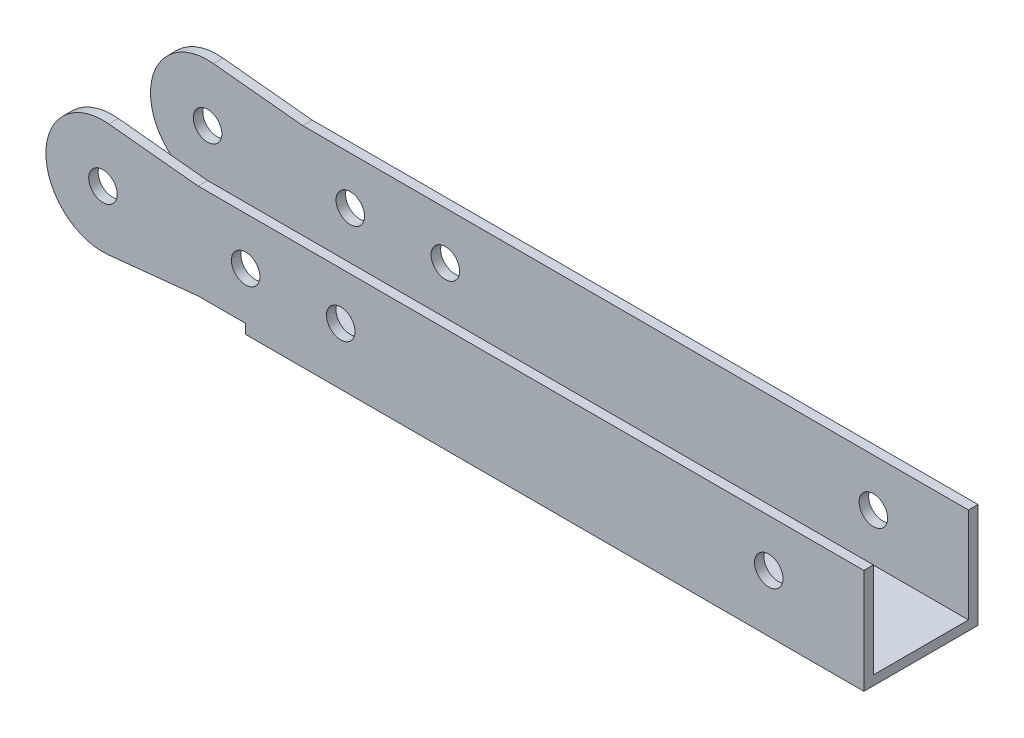
ISO-10303-21;
HEADER;
FILE_DESCRIPTION(('STEP AP214'),'2;1');
FILE_NAME('part.step','',(''),(''),'','','');
FILE_SCHEMA(('AUTOMOTIVE_DESIGN { 1 0 10303 214 1 1 1 1 }'));
ENDSEC;
DATA;
#1=APPLICATION_CONTEXT('core data for automotive mechanical design processes');
#2=APPLICATION_PROTOCOL_DEFINITION('international standard','automotive_design',2000,#1);
#3=PRODUCT_CONTEXT('',#1,'mechanical');
#4=PRODUCT('Part','Part','',(#3));
#5=PRODUCT_RELATED_PRODUCT_CATEGORY('part','',(#4));
#6=PRODUCT_DEFINITION_FORMATION('','',#4);
#7=PRODUCT_DEFINITION_CONTEXT('part definition',#1,'design');
#8=PRODUCT_DEFINITION('design','',#6,#7);
#9=PRODUCT_DEFINITION_SHAPE('','',#8);
#10=(LENGTH_UNIT() NAMED_UNIT(*) SI_UNIT(.MILLI.,.METRE.));
#11=(NAMED_UNIT(*) PLANE_ANGLE_UNIT() SI_UNIT($,.RADIAN.));
#12=(NAMED_UNIT(*) SI_UNIT($,.STERADIAN.) SOLID_ANGLE_UNIT());
#13=UNCERTAINTY_MEASURE_WITH_UNIT(LENGTH_MEASURE(1.E-05),#10,'distance_accuracy_value','');
#14=(GEOMETRIC_REPRESENTATION_CONTEXT(3) GLOBAL_UNCERTAINTY_ASSIGNED_CONTEXT((#13)) GLOBAL_UNIT_ASSIGNED_CONTEXT((#10,
#11,#12)) REPRESENTATION_CONTEXT('',''));
#15=CARTESIAN_POINT('',(0.,0.,0.));
#16=DIRECTION('',(0.,0.,1.));
#17=DIRECTION('',(1.,0.,0.));
#18=AXIS2_PLACEMENT_3D('',#15,#16,#17);
#19=CARTESIAN_POINT('',(-26.8000000000001,-2.,11.));
#20=DIRECTION('',(0.,1.,0.));
#21=DIRECTION('',(0.,0.,1.));
#22=AXIS2_PLACEMENT_3D('',#19,#20,#21);
#23=PLANE('',#22);
#24=DIRECTION('',(0.,0.,-1.));
#25=VECTOR('',#24,1.);
#26=CARTESIAN_POINT('',(-21.8000000000001,-2.,-1.00000000000001));
#27=LINE('',#26,#25);
#28=CARTESIAN_POINT('',(-21.8000000000001,-2.,11.));
#29=VERTEX_POINT('',#28);
#30=CARTESIAN_POINT('',(-21.8000000000001,-2.,10.));
#31=VERTEX_POINT('',#30);
#32=EDGE_CURVE('E151',#29,#31,#27,.T.);
#33=ORIENTED_EDGE('',*,*,#32,.F.);
#34=DIRECTION('',(1.,0.,0.));
#35=VECTOR('',#34,1.);
#36=CARTESIAN_POINT('',(-26.8000000000001,-2.,11.));
#37=LINE('',#36,#35);
#38=CARTESIAN_POINT('',(-26.8000000000001,-2.,11.));
#39=VERTEX_POINT('',#38);
#40=EDGE_CURVE('E119',#39,#29,#37,.T.);
#41=ORIENTED_EDGE('',*,*,#40,.F.);
#42=DIRECTION('',(0.,0.,-1.));
#43=VECTOR('',#42,1.);
#44=CARTESIAN_POINT('',(-26.8000000000001,-2.,11.));
#45=LINE('',#44,#43);
#46=CARTESIAN_POINT('',(-26.8000000000001,-2.,10.));
#47=VERTEX_POINT('',#46);
#48=EDGE_CURVE('E114',#39,#47,#45,.T.);
#49=ORIENTED_EDGE('',*,*,#48,.T.);
#50=DIRECTION('',(1.,0.,0.));
#51=VECTOR('',#50,1.);
#52=CARTESIAN_POINT('',(-26.8000000000001,-2.,10.));
#53=LINE('',#52,#51);
#54=EDGE_CURVE('E135',#47,#31,#53,.T.);
#55=ORIENTED_EDGE('',*,*,#54,.T.);
#56=EDGE_LOOP('',(#33,#41,#49,#55));
#57=FACE_BOUND('',#56,.T.);
#58=ADVANCED_FACE('F36',(#57),#23,.F.);
#59=CARTESIAN_POINT('',(-36.8000000000001,3.,11.));
#60=DIRECTION('',(0.,0.,1.));
#61=DIRECTION('',(1.,0.,0.));
#62=AXIS2_PLACEMENT_3D('',#59,#60,#61);
#63=PLANE('',#62);
#64=CARTESIAN_POINT('',(-21.8000000000001,3.,11.));
#65=DIRECTION('',(0.,0.,1.));
#66=DIRECTION('',(1.,0.,0.));
#67=AXIS2_PLACEMENT_3D('',#64,#65,#66);
#68=CIRCLE('',#67,1.5);
#69=CARTESIAN_POINT('',(-20.3000000000001,3.,11.));
#70=VERTEX_POINT('',#69);
#71=EDGE_CURVE('E299',#70,#70,#68,.T.);
#72=ORIENTED_EDGE('',*,*,#71,.F.);
#73=EDGE_LOOP('',(#72));
#74=FACE_BOUND('',#73,.T.);
#75=CARTESIAN_POINT('',(33.1999999999999,3.,11.));
#76=DIRECTION('',(0.,0.,1.));
#77=DIRECTION('',(1.,0.,0.));
#78=AXIS2_PLACEMENT_3D('',#75,#76,#77);
#79=CIRCLE('',#78,1.5);
#80=CARTESIAN_POINT('',(34.6999999999999,3.,11.));
#81=VERTEX_POINT('',#80);
#82=EDGE_CURVE('E130',#81,#81,#79,.T.);
#83=ORIENTED_EDGE('',*,*,#82,.F.);
#84=EDGE_LOOP('',(#83));
#85=FACE_BOUND('',#84,.T.);
#86=DIRECTION('',(-1.,0.,0.));
#87=VECTOR('',#86,1.);
#88=CARTESIAN_POINT('',(43.1999999999999,8.01039303833166,11.));
#89=LINE('',#88,#87);
#90=CARTESIAN_POINT('',(43.1999999999999,8.01039303833166,11.));
#91=VERTEX_POINT('',#90);
#92=CARTESIAN_POINT('',(-26.8000000000001,8.01039303833165,11.));
#93=VERTEX_POINT('',#92);
#94=EDGE_CURVE('E139',#91,#93,#89,.T.);
#95=ORIENTED_EDGE('',*,*,#94,.T.);
#96=DIRECTION('',(-0.994830345045225,0.101550896486432,0.));
#97=VECTOR('',#96,1.);
#98=CARTESIAN_POINT('',(-26.8000000000001,8.01039303833165,11.));
#99=LINE('',#98,#97);
#100=CARTESIAN_POINT('',(-36.1906946210815,8.96898207027135,11.));
#101=VERTEX_POINT('',#100);
#102=EDGE_CURVE('E90',#93,#101,#99,.T.);
#103=ORIENTED_EDGE('',*,*,#102,.T.);
#104=CARTESIAN_POINT('',(-36.8000000000001,3.,11.));
#105=DIRECTION('',(0.,0.,1.));
#106=DIRECTION('',(1.,0.,0.));
#107=AXIS2_PLACEMENT_3D('',#104,#105,#106);
#108=CIRCLE('',#107,6.);
#109=CARTESIAN_POINT('',(-36.1841554716937,-2.96831094338717,11.));
#110=VERTEX_POINT('',#109);
#111=EDGE_CURVE('E96',#101,#110,#108,.T.);
#112=ORIENTED_EDGE('',*,*,#111,.T.);
#113=DIRECTION('',(0.994718490564528,0.102640754717736,0.));
#114=VECTOR('',#113,1.);
#115=CARTESIAN_POINT('',(-36.1841554716937,-2.96831094338717,11.));
#116=LINE('',#115,#114);
#117=EDGE_CURVE('E102',#110,#39,#116,.T.);
#118=ORIENTED_EDGE('',*,*,#117,.T.);
#119=ORIENTED_EDGE('',*,*,#40,.T.);
#120=DIRECTION('',(0.,1.,0.));
#121=VECTOR('',#120,1.);
#122=CARTESIAN_POINT('',(-21.8000000000001,-3.,11.));
#123=LINE('',#122,#121);
#124=CARTESIAN_POINT('',(-21.8000000000001,-3.,11.));
#125=VERTEX_POINT('',#124);
#126=EDGE_CURVE('E155',#125,#29,#123,.T.);
#127=ORIENTED_EDGE('',*,*,#126,.F.);
#128=DIRECTION('',(-1.,0.,0.));
#129=VECTOR('',#128,1.);
#130=CARTESIAN_POINT('',(-21.8000000000001,-3.,11.));
#131=LINE('',#130,#129);
#132=CARTESIAN_POINT('',(43.1999999999999,-3.,11.));
#133=VERTEX_POINT('',#132);
#134=EDGE_CURVE('E273',#133,#125,#131,.T.);
#135=ORIENTED_EDGE('',*,*,#134,.F.);
#136=DIRECTION('',(0.,1.,0.));
#137=VECTOR('',#136,1.);
#138=CARTESIAN_POINT('',(43.1999999999999,-2.,11.));
#139=LINE('',#138,#137);
#140=EDGE_CURVE('E53',#133,#91,#139,.T.);
#141=ORIENTED_EDGE('',*,*,#140,.T.);
#142=EDGE_LOOP('',(#95,#103,#112,#118,#119,#127,#135,#141));
#143=FACE_BOUND('',#142,.T.);
#144=CARTESIAN_POINT('',(-11.8000000000001,3.,11.));
#145=DIRECTION('',(0.,0.,1.));
#146=DIRECTION('',(1.,0.,0.));
#147=AXIS2_PLACEMENT_3D('',#144,#145,#146);
#148=CIRCLE('',#147,1.5);
#149=CARTESIAN_POINT('',(-10.3000000000001,3.,11.));
#150=VERTEX_POINT('',#149);
#151=EDGE_CURVE('E305',#150,#150,#148,.T.);
#152=ORIENTED_EDGE('',*,*,#151,.F.);
#153=EDGE_LOOP('',(#152));
#154=FACE_BOUND('',#153,.T.);
#155=CARTESIAN_POINT('',(-36.8000000000001,3.,11.));
#156=DIRECTION('',(0.,0.,1.));
#157=DIRECTION('',(1.,0.,0.));
#158=AXIS2_PLACEMENT_3D('',#155,#156,#157);
#159=CIRCLE('',#158,1.5);
#160=CARTESIAN_POINT('',(-35.3000000000001,3.,11.));
#161=VERTEX_POINT('',#160);
#162=EDGE_CURVE('E293',#161,#161,#159,.T.);
#163=ORIENTED_EDGE('',*,*,#162,.F.);
#164=EDGE_LOOP('',(#163));
#165=FACE_BOUND('',#164,.T.);
#166=ADVANCED_FACE('F98',(#74,#85,#143,#154,#165),#63,.T.);
#167=CARTESIAN_POINT('',(-36.8000000000001,3.,10.));
#168=DIRECTION('',(0.,0.,1.));
#169=DIRECTION('',(1.,0.,0.));
#170=AXIS2_PLACEMENT_3D('',#167,#168,#169);
#171=PLANE('',#170);
#172=DIRECTION('',(-1.,0.,0.));
#173=VECTOR('',#172,1.);
#174=CARTESIAN_POINT('',(43.1999999999999,8.01039303833166,10.));
#175=LINE('',#174,#173);
#176=CARTESIAN_POINT('',(43.1999999999999,8.01039303833166,10.));
#177=VERTEX_POINT('',#176);
#178=CARTESIAN_POINT('',(-26.8000000000001,8.01039303833165,10.));
#179=VERTEX_POINT('',#178);
#180=EDGE_CURVE('E126',#177,#179,#175,.T.);
#181=ORIENTED_EDGE('',*,*,#180,.F.);
#182=DIRECTION('',(0.,1.,0.));
#183=VECTOR('',#182,1.);
#184=CARTESIAN_POINT('',(43.1999999999999,-2.,10.));
#185=LINE('',#184,#183);
#186=CARTESIAN_POINT('',(43.1999999999999,-2.,10.));
#187=VERTEX_POINT('',#186);
#188=EDGE_CURVE('E82',#187,#177,#185,.T.);
#189=ORIENTED_EDGE('',*,*,#188,.F.);
#190=DIRECTION('',(-1.,0.,0.));
#191=VECTOR('',#190,1.);
#192=CARTESIAN_POINT('',(-36.8000000000001,-2.,10.));
#193=LINE('',#192,#191);
#194=EDGE_CURVE('E290',#187,#31,#193,.T.);
#195=ORIENTED_EDGE('',*,*,#194,.T.);
#196=ORIENTED_EDGE('',*,*,#54,.F.);
#197=DIRECTION('',(0.994718490564528,0.102640754717736,0.));
#198=VECTOR('',#197,1.);
#199=CARTESIAN_POINT('',(-36.1841554716937,-2.96831094338717,10.));
#200=LINE('',#199,#198);
#201=CARTESIAN_POINT('',(-36.1841554716937,-2.96831094338717,10.));
#202=VERTEX_POINT('',#201);
#203=EDGE_CURVE('E133',#202,#47,#200,.T.);
#204=ORIENTED_EDGE('',*,*,#203,.F.);
#205=CARTESIAN_POINT('',(-36.8000000000001,3.,10.));
#206=DIRECTION('',(0.,0.,1.));
#207=DIRECTION('',(1.,0.,0.));
#208=AXIS2_PLACEMENT_3D('',#205,#206,#207);
#209=CIRCLE('',#208,6.);
#210=CARTESIAN_POINT('',(-36.1906946210815,8.96898207027135,10.));
#211=VERTEX_POINT('',#210);
#212=EDGE_CURVE('E111',#211,#202,#209,.T.);
#213=ORIENTED_EDGE('',*,*,#212,.F.);
#214=DIRECTION('',(-0.994830345045225,0.101550896486432,0.));
#215=VECTOR('',#214,1.);
#216=CARTESIAN_POINT('',(-26.8000000000001,8.01039303833165,10.));
#217=LINE('',#216,#215);
#218=EDGE_CURVE('E129',#179,#211,#217,.T.);
#219=ORIENTED_EDGE('',*,*,#218,.F.);
#220=EDGE_LOOP('',(#181,#189,#195,#196,#204,#213,#219));
#221=FACE_BOUND('',#220,.T.);
#222=CARTESIAN_POINT('',(33.1999999999999,3.,10.));
#223=DIRECTION('',(0.,0.,1.));
#224=DIRECTION('',(1.,0.,0.));
#225=AXIS2_PLACEMENT_3D('',#222,#223,#224);
#226=CIRCLE('',#225,1.5);
#227=CARTESIAN_POINT('',(34.6999999999999,3.,10.));
#228=VERTEX_POINT('',#227);
#229=EDGE_CURVE('E308',#228,#228,#226,.T.);
#230=ORIENTED_EDGE('',*,*,#229,.T.);
#231=EDGE_LOOP('',(#230));
#232=FACE_BOUND('',#231,.T.);
#233=CARTESIAN_POINT('',(-11.8000000000001,3.,10.));
#234=DIRECTION('',(0.,0.,1.));
#235=DIRECTION('',(1.,0.,0.));
#236=AXIS2_PLACEMENT_3D('',#233,#234,#235);
#237=CIRCLE('',#236,1.5);
#238=CARTESIAN_POINT('',(-10.3000000000001,3.,10.));
#239=VERTEX_POINT('',#238);
#240=EDGE_CURVE('E302',#239,#239,#237,.T.);
#241=ORIENTED_EDGE('',*,*,#240,.T.);
#242=EDGE_LOOP('',(#241));
#243=FACE_BOUND('',#242,.T.);
#244=CARTESIAN_POINT('',(-21.8000000000001,3.,10.));
#245=DIRECTION('',(0.,0.,1.));
#246=DIRECTION('',(1.,0.,0.));
#247=AXIS2_PLACEMENT_3D('',#244,#245,#246);
#248=CIRCLE('',#247,1.5);
#249=CARTESIAN_POINT('',(-20.3000000000001,3.,10.));
#250=VERTEX_POINT('',#249);
#251=EDGE_CURVE('E296',#250,#250,#248,.T.);
#252=ORIENTED_EDGE('',*,*,#251,.T.);
#253=EDGE_LOOP('',(#252));
#254=FACE_BOUND('',#253,.T.);
#255=CARTESIAN_POINT('',(-36.8000000000001,3.,10.));
#256=DIRECTION('',(0.,0.,1.));
#257=DIRECTION('',(1.,0.,0.));
#258=AXIS2_PLACEMENT_3D('',#255,#256,#257);
#259=CIRCLE('',#258,1.5);
#260=CARTESIAN_POINT('',(-35.3000000000001,3.,10.));
#261=VERTEX_POINT('',#260);
#262=EDGE_CURVE('E292',#261,#261,#259,.T.);
#263=ORIENTED_EDGE('',*,*,#262,.T.);
#264=EDGE_LOOP('',(#263));
#265=FACE_BOUND('',#264,.T.);
#266=ADVANCED_FACE('F143',(#221,#232,#243,#254,#265),#171,.F.);
#267=CARTESIAN_POINT('',(43.1999999999999,8.01039303833166,11.));
#268=DIRECTION('',(0.,-1.,0.));
#269=DIRECTION('',(1.,0.,0.));
#270=AXIS2_PLACEMENT_3D('',#267,#268,#269);
#271=PLANE('',#270);
#272=ORIENTED_EDGE('',*,*,#180,.T.);
#273=DIRECTION('',(0.,0.,-1.));
#274=VECTOR('',#273,1.);
#275=CARTESIAN_POINT('',(-26.8000000000001,8.01039303833165,11.));
#276=LINE('',#275,#274);
#277=EDGE_CURVE('E11',#93,#179,#276,.T.);
#278=ORIENTED_EDGE('',*,*,#277,.F.);
#279=ORIENTED_EDGE('',*,*,#94,.F.);
#280=DIRECTION('',(0.,0.,-1.));
#281=VECTOR('',#280,1.);
#282=CARTESIAN_POINT('',(43.1999999999999,8.01039303833166,11.));
#283=LINE('',#282,#281);
#284=EDGE_CURVE('E125',#91,#177,#283,.T.);
#285=ORIENTED_EDGE('',*,*,#284,.T.);
#286=EDGE_LOOP('',(#272,#278,#279,#285));
#287=FACE_BOUND('',#286,.T.);
#288=ADVANCED_FACE('F38',(#287),#271,.F.);
#289=CARTESIAN_POINT('',(-26.8000000000001,8.01039303833165,11.));
#290=DIRECTION('',(-0.101550896486432,-0.994830345045225,0.));
#291=DIRECTION('',(0.994830345045225,-0.101550896486432,0.));
#292=AXIS2_PLACEMENT_3D('',#289,#290,#291);
#293=PLANE('',#292);
#294=ORIENTED_EDGE('',*,*,#218,.T.);
#295=DIRECTION('',(0.,0.,-1.));
#296=VECTOR('',#295,1.);
#297=CARTESIAN_POINT('',(-36.1906946210815,8.96898207027135,11.));
#298=LINE('',#297,#296);
#299=EDGE_CURVE('E45',#101,#211,#298,.T.);
#300=ORIENTED_EDGE('',*,*,#299,.F.);
#301=ORIENTED_EDGE('',*,*,#102,.F.);
#302=ORIENTED_EDGE('',*,*,#277,.T.);
#303=EDGE_LOOP('',(#294,#300,#301,#302));
#304=FACE_BOUND('',#303,.T.);
#305=ADVANCED_FACE('F318',(#304),#293,.F.);
#306=CARTESIAN_POINT('',(-36.8000000000001,3.,11.));
#307=DIRECTION('',(0.,0.,-1.));
#308=DIRECTION('',(-1.,0.,0.));
#309=AXIS2_PLACEMENT_3D('',#306,#307,#308);
#310=CYLINDRICAL_SURFACE('',#309,6.);
#311=ORIENTED_EDGE('',*,*,#212,.T.);
#312=DIRECTION('',(0.,0.,-1.));
#313=VECTOR('',#312,1.);
#314=CARTESIAN_POINT('',(-36.1841554716937,-2.96831094338717,11.));
#315=LINE('',#314,#313);
#316=EDGE_CURVE('E108',#110,#202,#315,.T.);
#317=ORIENTED_EDGE('',*,*,#316,.F.);
#318=ORIENTED_EDGE('',*,*,#111,.F.);
#319=ORIENTED_EDGE('',*,*,#299,.T.);
#320=EDGE_LOOP('',(#311,#317,#318,#319));
#321=FACE_BOUND('',#320,.T.);
#322=ADVANCED_FACE('F109',(#321),#310,.T.);
#323=CARTESIAN_POINT('',(-36.1841554716937,-2.96831094338717,11.));
#324=DIRECTION('',(-0.102640754717736,0.994718490564528,0.));
#325=DIRECTION('',(-0.994718490564528,-0.102640754717736,0.));
#326=AXIS2_PLACEMENT_3D('',#323,#324,#325);
#327=PLANE('',#326);
#328=ORIENTED_EDGE('',*,*,#203,.T.);
#329=ORIENTED_EDGE('',*,*,#48,.F.);
#330=ORIENTED_EDGE('',*,*,#117,.F.);
#331=ORIENTED_EDGE('',*,*,#316,.T.);
#332=EDGE_LOOP('',(#328,#329,#330,#331));
#333=FACE_BOUND('',#332,.T.);
#334=ADVANCED_FACE('F116',(#333),#327,.F.);
#335=CARTESIAN_POINT('',(43.1999999999999,-2.,11.));
#336=DIRECTION('',(-1.,0.,0.));
#337=DIRECTION('',(0.,0.,1.));
#338=AXIS2_PLACEMENT_3D('',#335,#336,#337);
#339=PLANE('',#338);
#340=ORIENTED_EDGE('',*,*,#188,.T.);
#341=ORIENTED_EDGE('',*,*,#284,.F.);
#342=ORIENTED_EDGE('',*,*,#140,.F.);
#343=DIRECTION('',(0.,0.,1.));
#344=VECTOR('',#343,1.);
#345=CARTESIAN_POINT('',(43.1999999999999,-3.,11.));
#346=LINE('',#345,#344);
#347=CARTESIAN_POINT('',(43.1999999999999,-3.,-1.));
#348=VERTEX_POINT('',#347);
#349=EDGE_CURVE('E280',#348,#133,#346,.T.);
#350=ORIENTED_EDGE('',*,*,#349,.F.);
#351=DIRECTION('',(0.,1.,0.));
#352=VECTOR('',#351,1.);
#353=CARTESIAN_POINT('',(43.1999999999999,-3.,-1.));
#354=LINE('',#353,#352);
#355=CARTESIAN_POINT('',(43.1999999999999,8.01039303833166,-1.));
#356=VERTEX_POINT('',#355);
#357=EDGE_CURVE('E283',#348,#356,#354,.T.);
#358=ORIENTED_EDGE('',*,*,#357,.T.);
#359=DIRECTION('',(0.,0.,1.));
#360=VECTOR('',#359,1.);
#361=CARTESIAN_POINT('',(43.1999999999999,8.01039303833166,-1.));
#362=LINE('',#361,#360);
#363=CARTESIAN_POINT('',(43.1999999999999,8.01039303833166,0.));
#364=VERTEX_POINT('',#363);
#365=EDGE_CURVE('E265',#356,#364,#362,.T.);
#366=ORIENTED_EDGE('',*,*,#365,.T.);
#367=DIRECTION('',(0.,1.,0.));
#368=VECTOR('',#367,1.);
#369=CARTESIAN_POINT('',(43.1999999999999,8.01039303833166,0.));
#370=LINE('',#369,#368);
#371=CARTESIAN_POINT('',(43.1999999999999,-2.,0.));
#372=VERTEX_POINT('',#371);
#373=EDGE_CURVE('E240',#372,#364,#370,.T.);
#374=ORIENTED_EDGE('',*,*,#373,.F.);
#375=DIRECTION('',(0.,0.,1.));
#376=VECTOR('',#375,1.);
#377=CARTESIAN_POINT('',(43.1999999999999,-2.,11.));
#378=LINE('',#377,#376);
#379=EDGE_CURVE('E78',#372,#187,#378,.T.);
#380=ORIENTED_EDGE('',*,*,#379,.T.);
#381=EDGE_LOOP('',(#340,#341,#342,#350,#358,#366,#374,#380));
#382=FACE_BOUND('',#381,.T.);
#383=ADVANCED_FACE('F334',(#382),#339,.F.);
#384=CARTESIAN_POINT('',(33.1999999999999,3.,11.));
#385=DIRECTION('',(0.,0.,-1.));
#386=DIRECTION('',(-1.,0.,0.));
#387=AXIS2_PLACEMENT_3D('',#384,#385,#386);
#388=CYLINDRICAL_SURFACE('',#387,1.5);
#389=ORIENTED_EDGE('',*,*,#82,.T.);
#390=EDGE_LOOP('',(#389));
#391=FACE_BOUND('',#390,.T.);
#392=ORIENTED_EDGE('',*,*,#229,.F.);
#393=EDGE_LOOP('',(#392));
#394=FACE_BOUND('',#393,.T.);
#395=ADVANCED_FACE('F340',(#391,#394),#388,.F.);
#396=CARTESIAN_POINT('',(-11.8000000000001,3.,11.));
#397=DIRECTION('',(0.,0.,-1.));
#398=DIRECTION('',(-1.,0.,0.));
#399=AXIS2_PLACEMENT_3D('',#396,#397,#398);
#400=CYLINDRICAL_SURFACE('',#399,1.5);
#401=ORIENTED_EDGE('',*,*,#151,.T.);
#402=EDGE_LOOP('',(#401));
#403=FACE_BOUND('',#402,.T.);
#404=ORIENTED_EDGE('',*,*,#240,.F.);
#405=EDGE_LOOP('',(#404));
#406=FACE_BOUND('',#405,.T.);
#407=ADVANCED_FACE('F344',(#403,#406),#400,.F.);
#408=CARTESIAN_POINT('',(-21.8000000000001,3.,11.));
#409=DIRECTION('',(0.,0.,-1.));
#410=DIRECTION('',(-1.,0.,0.));
#411=AXIS2_PLACEMENT_3D('',#408,#409,#410);
#412=CYLINDRICAL_SURFACE('',#411,1.5);
#413=ORIENTED_EDGE('',*,*,#71,.T.);
#414=EDGE_LOOP('',(#413));
#415=FACE_BOUND('',#414,.T.);
#416=ORIENTED_EDGE('',*,*,#251,.F.);
#417=EDGE_LOOP('',(#416));
#418=FACE_BOUND('',#417,.T.);
#419=ADVANCED_FACE('F350',(#415,#418),#412,.F.);
#420=CARTESIAN_POINT('',(-36.8000000000001,3.,11.));
#421=DIRECTION('',(0.,0.,-1.));
#422=DIRECTION('',(-1.,0.,0.));
#423=AXIS2_PLACEMENT_3D('',#420,#421,#422);
#424=CYLINDRICAL_SURFACE('',#423,1.5);
#425=ORIENTED_EDGE('',*,*,#162,.T.);
#426=EDGE_LOOP('',(#425));
#427=FACE_BOUND('',#426,.T.);
#428=ORIENTED_EDGE('',*,*,#262,.F.);
#429=EDGE_LOOP('',(#428));
#430=FACE_BOUND('',#429,.T.);
#431=ADVANCED_FACE('F398',(#427,#430),#424,.F.);
#432=CARTESIAN_POINT('',(0.,-2.,0.));
#433=DIRECTION('',(0.,1.,0.));
#434=DIRECTION('',(0.,0.,1.));
#435=AXIS2_PLACEMENT_3D('',#432,#433,#434);
#436=PLANE('',#435);
#437=DIRECTION('',(1.,0.,0.));
#438=VECTOR('',#437,1.);
#439=CARTESIAN_POINT('',(-26.8000000000001,-2.,0.));
#440=LINE('',#439,#438);
#441=CARTESIAN_POINT('',(-21.8000000000001,-2.,0.));
#442=VERTEX_POINT('',#441);
#443=EDGE_CURVE('E257',#442,#372,#440,.T.);
#444=ORIENTED_EDGE('',*,*,#443,.F.);
#445=EDGE_CURVE('E272',#31,#442,#27,.T.);
#446=ORIENTED_EDGE('',*,*,#445,.F.);
#447=ORIENTED_EDGE('',*,*,#194,.F.);
#448=ORIENTED_EDGE('',*,*,#379,.F.);
#449=EDGE_LOOP('',(#444,#446,#447,#448));
#450=FACE_BOUND('',#449,.T.);
#451=ADVANCED_FACE('F406',(#450),#436,.T.);
#452=CARTESIAN_POINT('',(-21.8000000000001,-3.,-1.00000000000001));
#453=DIRECTION('',(1.,0.,0.));
#454=DIRECTION('',(0.,0.,-1.));
#455=AXIS2_PLACEMENT_3D('',#452,#453,#454);
#456=PLANE('',#455);
#457=ORIENTED_EDGE('',*,*,#32,.T.);
#458=ORIENTED_EDGE('',*,*,#445,.T.);
#459=DIRECTION('',(0.,0.,-1.));
#460=VECTOR('',#459,1.);
#461=CARTESIAN_POINT('',(-21.8000000000001,-2.,-1.00000000000001));
#462=LINE('',#461,#460);
#463=CARTESIAN_POINT('',(-21.8000000000001,-2.,-1.));
#464=VERTEX_POINT('',#463);
#465=EDGE_CURVE('E264',#442,#464,#462,.T.);
#466=ORIENTED_EDGE('',*,*,#465,.T.);
#467=DIRECTION('',(0.,1.,0.));
#468=VECTOR('',#467,1.);
#469=CARTESIAN_POINT('',(-21.8000000000001,-3.,-1.00000000000001));
#470=LINE('',#469,#468);
#471=CARTESIAN_POINT('',(-21.8000000000001,-3.,-1.00000000000001));
#472=VERTEX_POINT('',#471);
#473=EDGE_CURVE('E287',#472,#464,#470,.T.);
#474=ORIENTED_EDGE('',*,*,#473,.F.);
#475=DIRECTION('',(0.,0.,-1.));
#476=VECTOR('',#475,1.);
#477=CARTESIAN_POINT('',(-21.8000000000001,-3.,-1.00000000000001));
#478=LINE('',#477,#476);
#479=EDGE_CURVE('E276',#125,#472,#478,.T.);
#480=ORIENTED_EDGE('',*,*,#479,.F.);
#481=ORIENTED_EDGE('',*,*,#126,.T.);
#482=EDGE_LOOP('',(#457,#458,#466,#474,#480,#481));
#483=FACE_BOUND('',#482,.T.);
#484=ADVANCED_FACE('F438',(#483),#456,.F.);
#485=CARTESIAN_POINT('',(43.1999999999999,-3.,-1.));
#486=DIRECTION('',(0.,0.,1.));
#487=DIRECTION('',(1.,0.,0.));
#488=AXIS2_PLACEMENT_3D('',#485,#486,#487);
#489=PLANE('',#488);
#490=ORIENTED_EDGE('',*,*,#473,.T.);
#491=DIRECTION('',(1.,0.,0.));
#492=VECTOR('',#491,1.);
#493=CARTESIAN_POINT('',(-26.8000000000001,-2.,-1.));
#494=LINE('',#493,#492);
#495=CARTESIAN_POINT('',(-26.8000000000001,-2.,-1.));
#496=VERTEX_POINT('',#495);
#497=EDGE_CURVE('E247',#496,#464,#494,.T.);
#498=ORIENTED_EDGE('',*,*,#497,.F.);
#499=DIRECTION('',(0.994718490564528,0.102640754717736,0.));
#500=VECTOR('',#499,1.);
#501=CARTESIAN_POINT('',(-26.8000000000001,-2.,-1.));
#502=LINE('',#501,#500);
#503=CARTESIAN_POINT('',(-36.1841554716937,-2.96831094338717,-1.));
#504=VERTEX_POINT('',#503);
#505=EDGE_CURVE('E233',#504,#496,#502,.T.);
#506=ORIENTED_EDGE('',*,*,#505,.F.);
#507=CARTESIAN_POINT('',(-36.8000000000001,3.,-1.));
#508=DIRECTION('',(0.,0.,1.));
#509=DIRECTION('',(1.,0.,0.));
#510=AXIS2_PLACEMENT_3D('',#507,#508,#509);
#511=CIRCLE('',#510,6.);
#512=CARTESIAN_POINT('',(-36.1906946210815,8.96898207027135,-1.));
#513=VERTEX_POINT('',#512);
#514=EDGE_CURVE('E212',#513,#504,#511,.T.);
#515=ORIENTED_EDGE('',*,*,#514,.F.);
#516=DIRECTION('',(-0.994830345045225,0.101550896486433,0.));
#517=VECTOR('',#516,1.);
#518=CARTESIAN_POINT('',(-26.8000000000001,8.01039303833165,-1.));
#519=LINE('',#518,#517);
#520=CARTESIAN_POINT('',(-26.8000000000001,8.01039303833165,-1.));
#521=VERTEX_POINT('',#520);
#522=EDGE_CURVE('E229',#521,#513,#519,.T.);
#523=ORIENTED_EDGE('',*,*,#522,.F.);
#524=DIRECTION('',(-1.,0.,0.));
#525=VECTOR('',#524,1.);
#526=CARTESIAN_POINT('',(43.1999999999999,8.01039303833166,-1.));
#527=LINE('',#526,#525);
#528=EDGE_CURVE('E220',#356,#521,#527,.T.);
#529=ORIENTED_EDGE('',*,*,#528,.F.);
#530=ORIENTED_EDGE('',*,*,#357,.F.);
#531=DIRECTION('',(1.,0.,0.));
#532=VECTOR('',#531,1.);
#533=CARTESIAN_POINT('',(43.1999999999999,-3.,-1.));
#534=LINE('',#533,#532);
#535=EDGE_CURVE('E278',#472,#348,#534,.T.);
#536=ORIENTED_EDGE('',*,*,#535,.F.);
#537=EDGE_LOOP('',(#490,#498,#506,#515,#523,#529,#530,#536));
#538=FACE_BOUND('',#537,.T.);
#539=CARTESIAN_POINT('',(33.1999999999999,3.,-1.));
#540=DIRECTION('',(0.,0.,1.));
#541=DIRECTION('',(1.,0.,0.));
#542=AXIS2_PLACEMENT_3D('',#539,#540,#541);
#543=CIRCLE('',#542,1.5);
#544=CARTESIAN_POINT('',(34.6999999999999,3.,-1.));
#545=VERTEX_POINT('',#544);
#546=EDGE_CURVE('E565',#545,#545,#543,.T.);
#547=ORIENTED_EDGE('',*,*,#546,.T.);
#548=EDGE_LOOP('',(#547));
#549=FACE_BOUND('',#548,.T.);
#550=CARTESIAN_POINT('',(-11.8000000000001,3.,-1.));
#551=DIRECTION('',(0.,0.,1.));
#552=DIRECTION('',(1.,0.,0.));
#553=AXIS2_PLACEMENT_3D('',#550,#551,#552);
#554=CIRCLE('',#553,1.5);
#555=CARTESIAN_POINT('',(-10.3000000000001,3.,-1.));
#556=VERTEX_POINT('',#555);
#557=EDGE_CURVE('E573',#556,#556,#554,.T.);
#558=ORIENTED_EDGE('',*,*,#557,.T.);
#559=EDGE_LOOP('',(#558));
#560=FACE_BOUND('',#559,.T.);
#561=CARTESIAN_POINT('',(-21.8000000000001,3.,-1.));
#562=DIRECTION('',(0.,0.,1.));
#563=DIRECTION('',(1.,0.,0.));
#564=AXIS2_PLACEMENT_3D('',#561,#562,#563);
#565=CIRCLE('',#564,1.5);
#566=CARTESIAN_POINT('',(-20.3000000000001,3.,-1.));
#567=VERTEX_POINT('',#566);
#568=EDGE_CURVE('E579',#567,#567,#565,.T.);
#569=ORIENTED_EDGE('',*,*,#568,.T.);
#570=EDGE_LOOP('',(#569));
#571=FACE_BOUND('',#570,.T.);
#572=CARTESIAN_POINT('',(-36.8000000000001,3.,-1.));
#573=DIRECTION('',(0.,0.,1.));
#574=DIRECTION('',(1.,0.,0.));
#575=AXIS2_PLACEMENT_3D('',#572,#573,#574);
#576=CIRCLE('',#575,1.5);
#577=CARTESIAN_POINT('',(-35.3000000000001,3.,-1.));
#578=VERTEX_POINT('',#577);
#579=EDGE_CURVE('E252',#578,#578,#576,.T.);
#580=ORIENTED_EDGE('',*,*,#579,.T.);
#581=EDGE_LOOP('',(#580));
#582=FACE_BOUND('',#581,.T.);
#583=ADVANCED_FACE('F226',(#538,#549,#560,#571,#582),#489,.F.);
#584=CARTESIAN_POINT('',(0.,-3.,0.));
#585=DIRECTION('',(0.,1.,0.));
#586=DIRECTION('',(0.,0.,1.));
#587=AXIS2_PLACEMENT_3D('',#584,#585,#586);
#588=PLANE('',#587);
#589=ORIENTED_EDGE('',*,*,#134,.T.);
#590=ORIENTED_EDGE('',*,*,#479,.T.);
#591=ORIENTED_EDGE('',*,*,#535,.T.);
#592=ORIENTED_EDGE('',*,*,#349,.T.);
#593=EDGE_LOOP('',(#589,#590,#591,#592));
#594=FACE_BOUND('',#593,.T.);
#595=ADVANCED_FACE('F454',(#594),#588,.F.);
#596=CARTESIAN_POINT('',(-26.8000000000001,-2.,-1.));
#597=DIRECTION('',(0.,-1.,0.));
#598=DIRECTION('',(0.,0.,-1.));
#599=AXIS2_PLACEMENT_3D('',#596,#597,#598);
#600=PLANE('',#599);
#601=ORIENTED_EDGE('',*,*,#465,.F.);
#602=CARTESIAN_POINT('',(-26.8000000000001,-2.,0.));
#603=VERTEX_POINT('',#602);
#604=EDGE_CURVE('E258',#603,#442,#440,.T.);
#605=ORIENTED_EDGE('',*,*,#604,.F.);
#606=DIRECTION('',(0.,0.,1.));
#607=VECTOR('',#606,1.);
#608=CARTESIAN_POINT('',(-26.8000000000001,-2.,-1.));
#609=LINE('',#608,#607);
#610=EDGE_CURVE('E267',#496,#603,#609,.T.);
#611=ORIENTED_EDGE('',*,*,#610,.F.);
#612=ORIENTED_EDGE('',*,*,#497,.T.);
#613=EDGE_LOOP('',(#601,#605,#611,#612));
#614=FACE_BOUND('',#613,.T.);
#615=ADVANCED_FACE('F464',(#614),#600,.T.);
#616=CARTESIAN_POINT('',(-26.8000000000001,8.01039303833165,-1.));
#617=DIRECTION('',(0.101550896486433,0.994830345045225,0.));
#618=DIRECTION('',(-0.994830345045225,0.101550896486433,0.));
#619=AXIS2_PLACEMENT_3D('',#616,#617,#618);
#620=PLANE('',#619);
#621=DIRECTION('',(-0.994830345045225,0.101550896486433,0.));
#622=VECTOR('',#621,1.);
#623=CARTESIAN_POINT('',(-26.8000000000001,8.01039303833165,0.));
#624=LINE('',#623,#622);
#625=CARTESIAN_POINT('',(-26.8000000000001,8.01039303833165,0.));
#626=VERTEX_POINT('',#625);
#627=CARTESIAN_POINT('',(-36.1906946210815,8.96898207027135,0.));
#628=VERTEX_POINT('',#627);
#629=EDGE_CURVE('E250',#626,#628,#624,.T.);
#630=ORIENTED_EDGE('',*,*,#629,.F.);
#631=DIRECTION('',(0.,0.,1.));
#632=VECTOR('',#631,1.);
#633=CARTESIAN_POINT('',(-26.8000000000001,8.01039303833165,-1.));
#634=LINE('',#633,#632);
#635=EDGE_CURVE('E236',#521,#626,#634,.T.);
#636=ORIENTED_EDGE('',*,*,#635,.F.);
#637=ORIENTED_EDGE('',*,*,#522,.T.);
#638=DIRECTION('',(0.,0.,1.));
#639=VECTOR('',#638,1.);
#640=CARTESIAN_POINT('',(-36.1906946210815,8.96898207027135,-1.));
#641=LINE('',#640,#639);
#642=EDGE_CURVE('E209',#513,#628,#641,.T.);
#643=ORIENTED_EDGE('',*,*,#642,.T.);
#644=EDGE_LOOP('',(#630,#636,#637,#643));
#645=FACE_BOUND('',#644,.T.);
#646=ADVANCED_FACE('F235',(#645),#620,.T.);
#647=CARTESIAN_POINT('',(43.1999999999999,8.01039303833166,-1.));
#648=DIRECTION('',(0.,1.,0.));
#649=DIRECTION('',(-1.,0.,0.));
#650=AXIS2_PLACEMENT_3D('',#647,#648,#649);
#651=PLANE('',#650);
#652=DIRECTION('',(-1.,0.,0.));
#653=VECTOR('',#652,1.);
#654=CARTESIAN_POINT('',(43.1999999999999,8.01039303833166,0.));
#655=LINE('',#654,#653);
#656=EDGE_CURVE('E237',#364,#626,#655,.T.);
#657=ORIENTED_EDGE('',*,*,#656,.F.);
#658=ORIENTED_EDGE('',*,*,#365,.F.);
#659=ORIENTED_EDGE('',*,*,#528,.T.);
#660=ORIENTED_EDGE('',*,*,#635,.T.);
#661=EDGE_LOOP('',(#657,#658,#659,#660));
#662=FACE_BOUND('',#661,.T.);
#663=ADVANCED_FACE('F482',(#662),#651,.T.);
#664=CARTESIAN_POINT('',(-26.8000000000001,-2.,-1.));
#665=DIRECTION('',(0.102640754717736,-0.994718490564528,0.));
#666=DIRECTION('',(0.994718490564528,0.102640754717736,0.));
#667=AXIS2_PLACEMENT_3D('',#664,#665,#666);
#668=PLANE('',#667);
#669=DIRECTION('',(0.994718490564528,0.102640754717736,0.));
#670=VECTOR('',#669,1.);
#671=CARTESIAN_POINT('',(-26.8000000000001,-2.,0.));
#672=LINE('',#671,#670);
#673=CARTESIAN_POINT('',(-36.1841554716937,-2.96831094338717,0.));
#674=VERTEX_POINT('',#673);
#675=EDGE_CURVE('E254',#674,#603,#672,.T.);
#676=ORIENTED_EDGE('',*,*,#675,.F.);
#677=DIRECTION('',(0.,0.,1.));
#678=VECTOR('',#677,1.);
#679=CARTESIAN_POINT('',(-36.1841554716937,-2.96831094338717,-1.));
#680=LINE('',#679,#678);
#681=EDGE_CURVE('E219',#504,#674,#680,.T.);
#682=ORIENTED_EDGE('',*,*,#681,.F.);
#683=ORIENTED_EDGE('',*,*,#505,.T.);
#684=ORIENTED_EDGE('',*,*,#610,.T.);
#685=EDGE_LOOP('',(#676,#682,#683,#684));
#686=FACE_BOUND('',#685,.T.);
#687=ADVANCED_FACE('F491',(#686),#668,.T.);
#688=CARTESIAN_POINT('',(-36.8000000000001,3.,-1.));
#689=DIRECTION('',(0.,0.,1.));
#690=DIRECTION('',(1.,0.,0.));
#691=AXIS2_PLACEMENT_3D('',#688,#689,#690);
#692=CYLINDRICAL_SURFACE('',#691,6.);
#693=CARTESIAN_POINT('',(-36.8000000000001,3.,0.));
#694=DIRECTION('',(0.,0.,1.));
#695=DIRECTION('',(1.,0.,0.));
#696=AXIS2_PLACEMENT_3D('',#693,#694,#695);
#697=CIRCLE('',#696,6.);
#698=EDGE_CURVE('E214',#628,#674,#697,.T.);
#699=ORIENTED_EDGE('',*,*,#698,.F.);
#700=ORIENTED_EDGE('',*,*,#642,.F.);
#701=ORIENTED_EDGE('',*,*,#514,.T.);
#702=ORIENTED_EDGE('',*,*,#681,.T.);
#703=EDGE_LOOP('',(#699,#700,#701,#702));
#704=FACE_BOUND('',#703,.T.);
#705=ADVANCED_FACE('F211',(#704),#692,.T.);
#706=CARTESIAN_POINT('',(-36.8000000000001,3.,0.));
#707=DIRECTION('',(0.,0.,1.));
#708=DIRECTION('',(1.,0.,0.));
#709=AXIS2_PLACEMENT_3D('',#706,#707,#708);
#710=PLANE('',#709);
#711=CARTESIAN_POINT('',(33.1999999999999,3.,0.));
#712=DIRECTION('',(0.,0.,1.));
#713=DIRECTION('',(1.,0.,0.));
#714=AXIS2_PLACEMENT_3D('',#711,#712,#713);
#715=CIRCLE('',#714,1.5);
#716=CARTESIAN_POINT('',(34.6999999999999,3.,0.));
#717=VERTEX_POINT('',#716);
#718=EDGE_CURVE('E568',#717,#717,#715,.T.);
#719=ORIENTED_EDGE('',*,*,#718,.F.);
#720=EDGE_LOOP('',(#719));
#721=FACE_BOUND('',#720,.T.);
#722=CARTESIAN_POINT('',(-11.8000000000001,3.,0.));
#723=DIRECTION('',(0.,0.,1.));
#724=DIRECTION('',(1.,0.,0.));
#725=AXIS2_PLACEMENT_3D('',#722,#723,#724);
#726=CIRCLE('',#725,1.5);
#727=CARTESIAN_POINT('',(-10.3000000000001,3.,0.));
#728=VERTEX_POINT('',#727);
#729=EDGE_CURVE('E570',#728,#728,#726,.T.);
#730=ORIENTED_EDGE('',*,*,#729,.F.);
#731=EDGE_LOOP('',(#730));
#732=FACE_BOUND('',#731,.T.);
#733=CARTESIAN_POINT('',(-21.8000000000001,3.,0.));
#734=DIRECTION('',(0.,0.,1.));
#735=DIRECTION('',(1.,0.,0.));
#736=AXIS2_PLACEMENT_3D('',#733,#734,#735);
#737=CIRCLE('',#736,1.5);
#738=CARTESIAN_POINT('',(-20.3000000000001,3.,0.));
#739=VERTEX_POINT('',#738);
#740=EDGE_CURVE('E576',#739,#739,#737,.T.);
#741=ORIENTED_EDGE('',*,*,#740,.F.);
#742=EDGE_LOOP('',(#741));
#743=FACE_BOUND('',#742,.T.);
#744=CARTESIAN_POINT('',(-36.8000000000001,3.,0.));
#745=DIRECTION('',(0.,0.,1.));
#746=DIRECTION('',(1.,0.,0.));
#747=AXIS2_PLACEMENT_3D('',#744,#745,#746);
#748=CIRCLE('',#747,1.5);
#749=CARTESIAN_POINT('',(-35.3000000000001,3.,0.));
#750=VERTEX_POINT('',#749);
#751=EDGE_CURVE('E243',#750,#750,#748,.T.);
#752=ORIENTED_EDGE('',*,*,#751,.F.);
#753=EDGE_LOOP('',(#752));
#754=FACE_BOUND('',#753,.T.);
#755=ORIENTED_EDGE('',*,*,#629,.T.);
#756=ORIENTED_EDGE('',*,*,#698,.T.);
#757=ORIENTED_EDGE('',*,*,#675,.T.);
#758=ORIENTED_EDGE('',*,*,#604,.T.);
#759=ORIENTED_EDGE('',*,*,#443,.T.);
#760=ORIENTED_EDGE('',*,*,#373,.T.);
#761=ORIENTED_EDGE('',*,*,#656,.T.);
#762=EDGE_LOOP('',(#755,#756,#757,#758,#759,#760,#761));
#763=FACE_BOUND('',#762,.T.);
#764=ADVANCED_FACE('F510',(#721,#732,#743,#754,#763),#710,.T.);
#765=CARTESIAN_POINT('',(-36.8000000000001,3.,-1.));
#766=DIRECTION('',(0.,0.,1.));
#767=DIRECTION('',(1.,0.,0.));
#768=AXIS2_PLACEMENT_3D('',#765,#766,#767);
#769=CYLINDRICAL_SURFACE('',#768,1.5);
#770=ORIENTED_EDGE('',*,*,#579,.F.);
#771=EDGE_LOOP('',(#770));
#772=FACE_BOUND('',#771,.T.);
#773=ORIENTED_EDGE('',*,*,#751,.T.);
#774=EDGE_LOOP('',(#773));
#775=FACE_BOUND('',#774,.T.);
#776=ADVANCED_FACE('F519',(#772,#775),#769,.F.);
#777=CARTESIAN_POINT('',(-21.8000000000001,3.,-1.));
#778=DIRECTION('',(0.,0.,1.));
#779=DIRECTION('',(1.,0.,0.));
#780=AXIS2_PLACEMENT_3D('',#777,#778,#779);
#781=CYLINDRICAL_SURFACE('',#780,1.5);
#782=ORIENTED_EDGE('',*,*,#568,.F.);
#783=EDGE_LOOP('',(#782));
#784=FACE_BOUND('',#783,.T.);
#785=ORIENTED_EDGE('',*,*,#740,.T.);
#786=EDGE_LOOP('',(#785));
#787=FACE_BOUND('',#786,.T.);
#788=ADVANCED_FACE('F529',(#784,#787),#781,.F.);
#789=CARTESIAN_POINT('',(-11.8000000000001,3.,-1.));
#790=DIRECTION('',(0.,0.,1.));
#791=DIRECTION('',(1.,0.,0.));
#792=AXIS2_PLACEMENT_3D('',#789,#790,#791);
#793=CYLINDRICAL_SURFACE('',#792,1.5);
#794=ORIENTED_EDGE('',*,*,#557,.F.);
#795=EDGE_LOOP('',(#794));
#796=FACE_BOUND('',#795,.T.);
#797=ORIENTED_EDGE('',*,*,#729,.T.);
#798=EDGE_LOOP('',(#797));
#799=FACE_BOUND('',#798,.T.);
#800=ADVANCED_FACE('F539',(#796,#799),#793,.F.);
#801=CARTESIAN_POINT('',(33.1999999999999,3.,-1.));
#802=DIRECTION('',(0.,0.,1.));
#803=DIRECTION('',(1.,0.,0.));
#804=AXIS2_PLACEMENT_3D('',#801,#802,#803);
#805=CYLINDRICAL_SURFACE('',#804,1.5);
#806=ORIENTED_EDGE('',*,*,#546,.F.);
#807=EDGE_LOOP('',(#806));
#808=FACE_BOUND('',#807,.T.);
#809=ORIENTED_EDGE('',*,*,#718,.T.);
#810=EDGE_LOOP('',(#809));
#811=FACE_BOUND('',#810,.T.);
#812=ADVANCED_FACE('F549',(#808,#811),#805,.F.);
#813=CLOSED_SHELL('',(#58,#166,#266,#288,#305,#322,#334,#383,#395,#407,#419,#431,#451,#484,#583,
#595,#615,#646,#663,#687,#705,#764,#776,#788,#800,#812));
#814=MANIFOLD_SOLID_BREP('B2',#813);
#815=ADVANCED_BREP_SHAPE_REPRESENTATION('',(#18,#814),#14);
#816=SHAPE_DEFINITION_REPRESENTATION(#9,#815);
ENDSEC;
END-ISO-10303-21;
